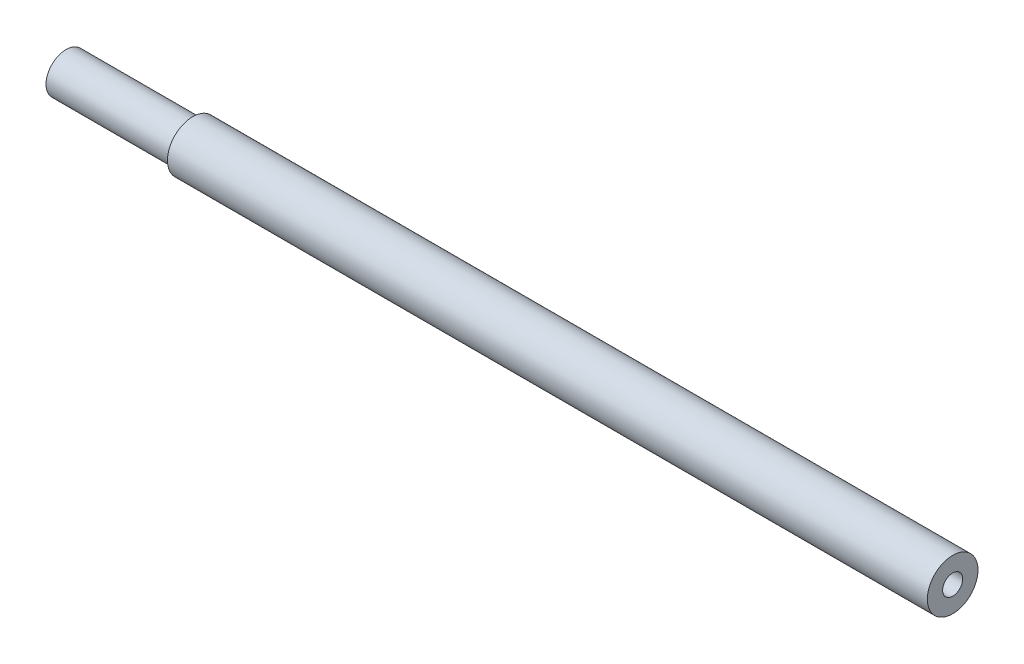
ISO-10303-21;
HEADER;
FILE_DESCRIPTION(('STEP AP214'),'2;1');
FILE_NAME('part.step','',(''),(''),'','','');
FILE_SCHEMA(('AUTOMOTIVE_DESIGN { 1 0 10303 214 1 1 1 1 }'));
ENDSEC;
DATA;
#1=APPLICATION_CONTEXT('core data for automotive mechanical design processes');
#2=APPLICATION_PROTOCOL_DEFINITION('international standard','automotive_design',2000,#1);
#3=PRODUCT_CONTEXT('',#1,'mechanical');
#4=PRODUCT('Part','Part','',(#3));
#5=PRODUCT_RELATED_PRODUCT_CATEGORY('part','',(#4));
#6=PRODUCT_DEFINITION_FORMATION('','',#4);
#7=PRODUCT_DEFINITION_CONTEXT('part definition',#1,'design');
#8=PRODUCT_DEFINITION('design','',#6,#7);
#9=PRODUCT_DEFINITION_SHAPE('','',#8);
#10=(LENGTH_UNIT() NAMED_UNIT(*) SI_UNIT(.MILLI.,.METRE.));
#11=(NAMED_UNIT(*) PLANE_ANGLE_UNIT() SI_UNIT($,.RADIAN.));
#12=(NAMED_UNIT(*) SI_UNIT($,.STERADIAN.) SOLID_ANGLE_UNIT());
#13=UNCERTAINTY_MEASURE_WITH_UNIT(LENGTH_MEASURE(1.E-05),#10,'distance_accuracy_value','');
#14=(GEOMETRIC_REPRESENTATION_CONTEXT(3) GLOBAL_UNCERTAINTY_ASSIGNED_CONTEXT((#13)) GLOBAL_UNIT_ASSIGNED_CONTEXT((#10,
#11,#12)) REPRESENTATION_CONTEXT('',''));
#15=CARTESIAN_POINT('',(0.,0.,0.));
#16=DIRECTION('',(0.,0.,1.));
#17=DIRECTION('',(1.,0.,0.));
#18=AXIS2_PLACEMENT_3D('',#15,#16,#17);
#19=CARTESIAN_POINT('',(-30.,0.,0.));
#20=DIRECTION('',(1.,0.,0.));
#21=DIRECTION('',(0.,0.,-1.));
#22=AXIS2_PLACEMENT_3D('',#19,#20,#21);
#23=PLANE('',#22);
#24=CARTESIAN_POINT('',(-30.,0.,0.));
#25=DIRECTION('',(1.,0.,0.));
#26=DIRECTION('',(0.,0.,-1.));
#27=AXIS2_PLACEMENT_3D('',#24,#25,#26);
#28=CIRCLE('',#27,2.);
#29=CARTESIAN_POINT('',(-30.,0.,-2.));
#30=VERTEX_POINT('',#29);
#31=EDGE_CURVE('E43',#30,#30,#28,.T.);
#32=ORIENTED_EDGE('',*,*,#31,.F.);
#33=EDGE_LOOP('',(#32));
#34=FACE_BOUND('',#33,.T.);
#35=CARTESIAN_POINT('',(-30.,0.,0.));
#36=DIRECTION('',(1.,0.,0.));
#37=DIRECTION('',(0.,0.,-1.));
#38=AXIS2_PLACEMENT_3D('',#35,#36,#37);
#39=CIRCLE('',#38,1.5875);
#40=CARTESIAN_POINT('',(-30.,0.,-1.5875));
#41=VERTEX_POINT('',#40);
#42=EDGE_CURVE('E10',#41,#41,#39,.F.);
#43=ORIENTED_EDGE('',*,*,#42,.F.);
#44=EDGE_LOOP('',(#43));
#45=FACE_BOUND('',#44,.T.);
#46=ADVANCED_FACE('F32',(#34,#45),#23,.F.);
#47=CARTESIAN_POINT('',(30.,0.,0.));
#48=DIRECTION('',(-1.,0.,0.));
#49=DIRECTION('',(0.,0.,1.));
#50=AXIS2_PLACEMENT_3D('',#47,#48,#49);
#51=CYLINDRICAL_SURFACE('',#50,2.);
#52=CARTESIAN_POINT('',(30.,0.,0.));
#53=DIRECTION('',(1.,0.,0.));
#54=DIRECTION('',(0.,0.,-1.));
#55=AXIS2_PLACEMENT_3D('',#52,#53,#54);
#56=CIRCLE('',#55,2.);
#57=CARTESIAN_POINT('',(30.,0.,-2.));
#58=VERTEX_POINT('',#57);
#59=EDGE_CURVE('E39',#58,#58,#56,.T.);
#60=ORIENTED_EDGE('',*,*,#59,.F.);
#61=EDGE_LOOP('',(#60));
#62=FACE_BOUND('',#61,.T.);
#63=ORIENTED_EDGE('',*,*,#31,.T.);
#64=EDGE_LOOP('',(#63));
#65=FACE_BOUND('',#64,.T.);
#66=ADVANCED_FACE('F34',(#62,#65),#51,.T.);
#67=CARTESIAN_POINT('',(30.,0.,0.));
#68=DIRECTION('',(1.,0.,0.));
#69=DIRECTION('',(0.,0.,-1.));
#70=AXIS2_PLACEMENT_3D('',#67,#68,#69);
#71=PLANE('',#70);
#72=CARTESIAN_POINT('',(30.,0.,0.));
#73=DIRECTION('',(1.,0.,0.));
#74=DIRECTION('',(0.,0.,-1.));
#75=AXIS2_PLACEMENT_3D('',#72,#73,#74);
#76=CIRCLE('',#75,0.795);
#77=CARTESIAN_POINT('',(30.,0.,-0.795));
#78=VERTEX_POINT('',#77);
#79=EDGE_CURVE('E50',#78,#78,#76,.T.);
#80=ORIENTED_EDGE('',*,*,#79,.F.);
#81=EDGE_LOOP('',(#80));
#82=FACE_BOUND('',#81,.T.);
#83=ORIENTED_EDGE('',*,*,#59,.T.);
#84=EDGE_LOOP('',(#83));
#85=FACE_BOUND('',#84,.T.);
#86=ADVANCED_FACE('F78',(#82,#85),#71,.T.);
#87=CARTESIAN_POINT('',(23.,0.,0.));
#88=DIRECTION('',(1.,0.,0.));
#89=DIRECTION('',(0.,0.,-1.));
#90=AXIS2_PLACEMENT_3D('',#87,#88,#89);
#91=CYLINDRICAL_SURFACE('',#90,0.795);
#92=CARTESIAN_POINT('',(23.,0.,0.));
#93=DIRECTION('',(1.,0.,0.));
#94=DIRECTION('',(0.,0.,-1.));
#95=AXIS2_PLACEMENT_3D('',#92,#93,#94);
#96=CIRCLE('',#95,0.795);
#97=CARTESIAN_POINT('',(23.,0.,-0.795));
#98=VERTEX_POINT('',#97);
#99=EDGE_CURVE('E48',#98,#98,#96,.T.);
#100=ORIENTED_EDGE('',*,*,#99,.F.);
#101=EDGE_LOOP('',(#100));
#102=FACE_BOUND('',#101,.T.);
#103=ORIENTED_EDGE('',*,*,#79,.T.);
#104=EDGE_LOOP('',(#103));
#105=FACE_BOUND('',#104,.T.);
#106=ADVANCED_FACE('F70',(#102,#105),#91,.F.);
#107=CARTESIAN_POINT('',(23.,0.,0.));
#108=DIRECTION('',(1.,0.,0.));
#109=DIRECTION('',(0.,0.,-1.));
#110=AXIS2_PLACEMENT_3D('',#107,#108,#109);
#111=PLANE('',#110);
#112=ORIENTED_EDGE('',*,*,#99,.T.);
#113=EDGE_LOOP('',(#112));
#114=FACE_BOUND('',#113,.T.);
#115=ADVANCED_FACE('F63',(#114),#111,.T.);
#116=CARTESIAN_POINT('',(-40.,0.,0.));
#117=DIRECTION('',(1.,0.,0.));
#118=DIRECTION('',(0.,0.,-1.));
#119=AXIS2_PLACEMENT_3D('',#116,#117,#118);
#120=CYLINDRICAL_SURFACE('',#119,1.5875);
#121=CARTESIAN_POINT('',(-40.,0.,0.));
#122=DIRECTION('',(-1.,0.,0.));
#123=DIRECTION('',(0.,0.,1.));
#124=AXIS2_PLACEMENT_3D('',#121,#122,#123);
#125=CIRCLE('',#124,1.5875);
#126=CARTESIAN_POINT('',(-40.,0.,1.5875));
#127=VERTEX_POINT('',#126);
#128=EDGE_CURVE('E53',#127,#127,#125,.T.);
#129=ORIENTED_EDGE('',*,*,#128,.F.);
#130=EDGE_LOOP('',(#129));
#131=FACE_BOUND('',#130,.T.);
#132=ORIENTED_EDGE('',*,*,#42,.T.);
#133=EDGE_LOOP('',(#132));
#134=FACE_BOUND('',#133,.T.);
#135=ADVANCED_FACE('F61',(#131,#134),#120,.T.);
#136=CARTESIAN_POINT('',(-40.,0.,0.));
#137=DIRECTION('',(-1.,0.,0.));
#138=DIRECTION('',(0.,0.,1.));
#139=AXIS2_PLACEMENT_3D('',#136,#137,#138);
#140=PLANE('',#139);
#141=ORIENTED_EDGE('',*,*,#128,.T.);
#142=EDGE_LOOP('',(#141));
#143=FACE_BOUND('',#142,.T.);
#144=ADVANCED_FACE('F59',(#143),#140,.T.);
#145=CLOSED_SHELL('',(#46,#66,#86,#106,#115,#135,#144));
#146=MANIFOLD_SOLID_BREP('B2',#145);
#147=ADVANCED_BREP_SHAPE_REPRESENTATION('',(#18,#146),#14);
#148=SHAPE_DEFINITION_REPRESENTATION(#9,#147);
ENDSEC;
END-ISO-10303-21;
